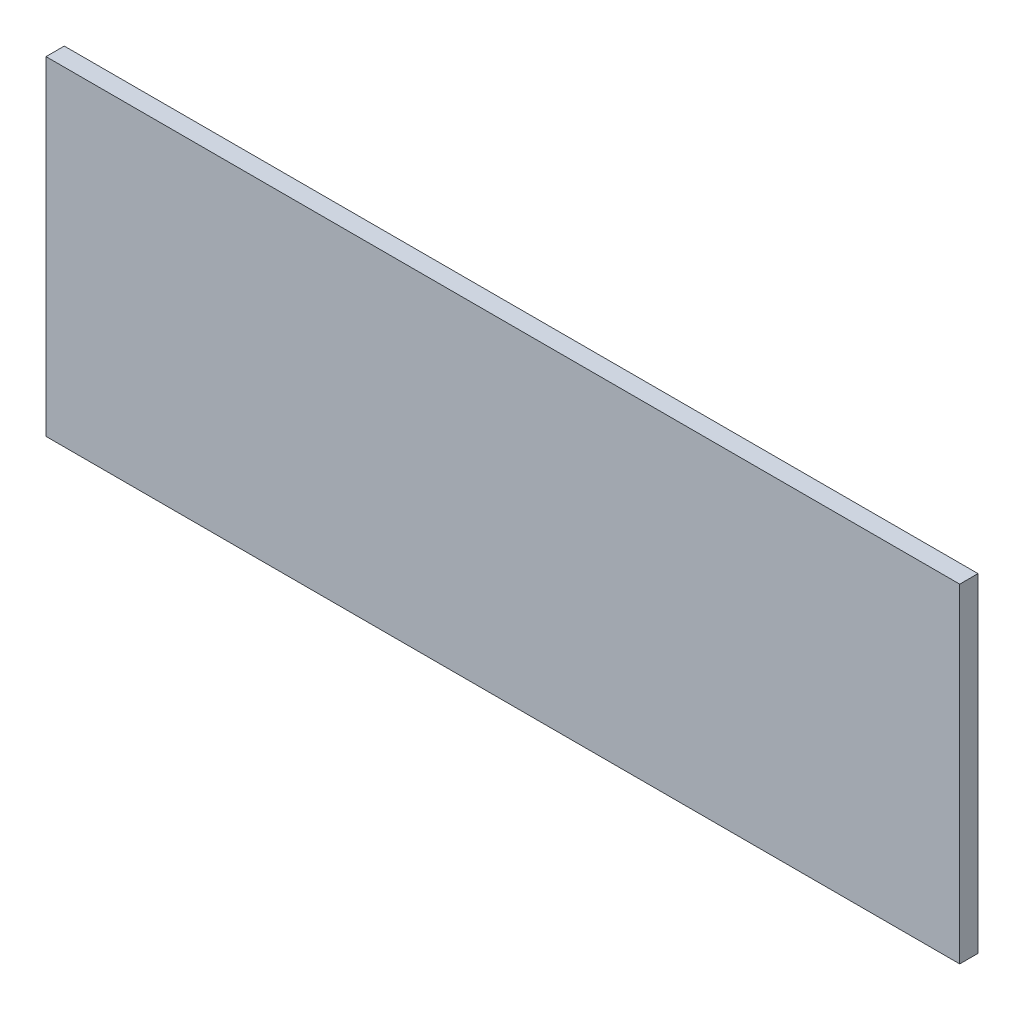
ISO-10303-21;
HEADER;
FILE_DESCRIPTION(('STEP AP214'),'2;1');
FILE_NAME('part.step','',(''),(''),'','','');
FILE_SCHEMA(('AUTOMOTIVE_DESIGN { 1 0 10303 214 1 1 1 1 }'));
ENDSEC;
DATA;
#1=APPLICATION_CONTEXT('core data for automotive mechanical design processes');
#2=APPLICATION_PROTOCOL_DEFINITION('international standard','automotive_design',2000,#1);
#3=PRODUCT_CONTEXT('',#1,'mechanical');
#4=PRODUCT('Part','Part','',(#3));
#5=PRODUCT_RELATED_PRODUCT_CATEGORY('part','',(#4));
#6=PRODUCT_DEFINITION_FORMATION('','',#4);
#7=PRODUCT_DEFINITION_CONTEXT('part definition',#1,'design');
#8=PRODUCT_DEFINITION('design','',#6,#7);
#9=PRODUCT_DEFINITION_SHAPE('','',#8);
#10=(LENGTH_UNIT() NAMED_UNIT(*) SI_UNIT(.MILLI.,.METRE.));
#11=(NAMED_UNIT(*) PLANE_ANGLE_UNIT() SI_UNIT($,.RADIAN.));
#12=(NAMED_UNIT(*) SI_UNIT($,.STERADIAN.) SOLID_ANGLE_UNIT());
#13=UNCERTAINTY_MEASURE_WITH_UNIT(LENGTH_MEASURE(1.E-05),#10,'distance_accuracy_value','');
#14=(GEOMETRIC_REPRESENTATION_CONTEXT(3) GLOBAL_UNCERTAINTY_ASSIGNED_CONTEXT((#13)) GLOBAL_UNIT_ASSIGNED_CONTEXT((#10,
#11,#12)) REPRESENTATION_CONTEXT('',''));
#15=CARTESIAN_POINT('',(0.,0.,0.));
#16=DIRECTION('',(0.,0.,1.));
#17=DIRECTION('',(1.,0.,0.));
#18=AXIS2_PLACEMENT_3D('',#15,#16,#17);
#19=CARTESIAN_POINT('',(0.,-2.25,0.12));
#20=DIRECTION('',(0.,0.,1.));
#21=DIRECTION('',(0.,-1.,0.));
#22=AXIS2_PLACEMENT_3D('',#19,#20,#21);
#23=PLANE('',#22);
#24=DIRECTION('',(-1.,0.,0.));
#25=VECTOR('',#24,1.);
#26=CARTESIAN_POINT('',(0.,0.,0.12));
#27=LINE('',#26,#25);
#28=CARTESIAN_POINT('',(6.25,0.,0.12));
#29=VERTEX_POINT('',#28);
#30=CARTESIAN_POINT('',(-6.25,0.,0.12));
#31=VERTEX_POINT('',#30);
#32=EDGE_CURVE('E11',#29,#31,#27,.T.);
#33=ORIENTED_EDGE('',*,*,#32,.F.);
#34=DIRECTION('',(0.,1.,0.));
#35=VECTOR('',#34,1.);
#36=CARTESIAN_POINT('',(6.25,-2.25,0.12));
#37=LINE('',#36,#35);
#38=CARTESIAN_POINT('',(6.25,-4.5,0.12));
#39=VERTEX_POINT('',#38);
#40=EDGE_CURVE('E70',#39,#29,#37,.T.);
#41=ORIENTED_EDGE('',*,*,#40,.F.);
#42=DIRECTION('',(1.,0.,0.));
#43=VECTOR('',#42,1.);
#44=CARTESIAN_POINT('',(0.,-4.5,0.12));
#45=LINE('',#44,#43);
#46=CARTESIAN_POINT('',(-6.25,-4.5,0.12));
#47=VERTEX_POINT('',#46);
#48=EDGE_CURVE('E19',#47,#39,#45,.T.);
#49=ORIENTED_EDGE('',*,*,#48,.F.);
#50=DIRECTION('',(0.,-1.,0.));
#51=VECTOR('',#50,1.);
#52=CARTESIAN_POINT('',(-6.25,-2.25,0.12));
#53=LINE('',#52,#51);
#54=EDGE_CURVE('E71',#31,#47,#53,.T.);
#55=ORIENTED_EDGE('',*,*,#54,.F.);
#56=EDGE_LOOP('',(#33,#41,#49,#55));
#57=FACE_BOUND('',#56,.T.);
#58=ADVANCED_FACE('F16',(#57),#23,.F.);
#59=CARTESIAN_POINT('',(0.,0.,0.12));
#60=DIRECTION('',(0.,1.,0.));
#61=DIRECTION('',(1.,0.,0.));
#62=AXIS2_PLACEMENT_3D('',#59,#60,#61);
#63=PLANE('',#62);
#64=ORIENTED_EDGE('',*,*,#32,.T.);
#65=DIRECTION('',(0.,0.,-1.));
#66=VECTOR('',#65,1.);
#67=CARTESIAN_POINT('',(-6.25,0.,0.12));
#68=LINE('',#67,#66);
#69=CARTESIAN_POINT('',(-6.25,0.,0.37));
#70=VERTEX_POINT('',#69);
#71=EDGE_CURVE('E26',#70,#31,#68,.T.);
#72=ORIENTED_EDGE('',*,*,#71,.F.);
#73=DIRECTION('',(-1.,0.,0.));
#74=VECTOR('',#73,1.);
#75=CARTESIAN_POINT('',(0.,0.,0.37));
#76=LINE('',#75,#74);
#77=CARTESIAN_POINT('',(6.25,0.,0.37));
#78=VERTEX_POINT('',#77);
#79=EDGE_CURVE('E76',#78,#70,#76,.T.);
#80=ORIENTED_EDGE('',*,*,#79,.F.);
#81=DIRECTION('',(0.,0.,1.));
#82=VECTOR('',#81,1.);
#83=CARTESIAN_POINT('',(6.25,0.,0.12));
#84=LINE('',#83,#82);
#85=EDGE_CURVE('E73',#29,#78,#84,.T.);
#86=ORIENTED_EDGE('',*,*,#85,.F.);
#87=EDGE_LOOP('',(#64,#72,#80,#86));
#88=FACE_BOUND('',#87,.T.);
#89=ADVANCED_FACE('F74',(#88),#63,.T.);
#90=CARTESIAN_POINT('',(-6.25,-2.25,0.12));
#91=DIRECTION('',(-1.,0.,0.));
#92=DIRECTION('',(0.,0.,1.));
#93=AXIS2_PLACEMENT_3D('',#90,#91,#92);
#94=PLANE('',#93);
#95=ORIENTED_EDGE('',*,*,#54,.T.);
#96=DIRECTION('',(0.,0.,-1.));
#97=VECTOR('',#96,1.);
#98=CARTESIAN_POINT('',(-6.25,-4.5,0.12));
#99=LINE('',#98,#97);
#100=CARTESIAN_POINT('',(-6.25,-4.5,0.37));
#101=VERTEX_POINT('',#100);
#102=EDGE_CURVE('E96',#101,#47,#99,.T.);
#103=ORIENTED_EDGE('',*,*,#102,.F.);
#104=DIRECTION('',(0.,-1.,0.));
#105=VECTOR('',#104,1.);
#106=CARTESIAN_POINT('',(-6.25,-2.25,0.37));
#107=LINE('',#106,#105);
#108=EDGE_CURVE('E85',#70,#101,#107,.T.);
#109=ORIENTED_EDGE('',*,*,#108,.F.);
#110=ORIENTED_EDGE('',*,*,#71,.T.);
#111=EDGE_LOOP('',(#95,#103,#109,#110));
#112=FACE_BOUND('',#111,.T.);
#113=ADVANCED_FACE('F115',(#112),#94,.T.);
#114=CARTESIAN_POINT('',(0.,-4.5,0.12));
#115=DIRECTION('',(0.,-1.,0.));
#116=DIRECTION('',(0.,0.,-1.));
#117=AXIS2_PLACEMENT_3D('',#114,#115,#116);
#118=PLANE('',#117);
#119=ORIENTED_EDGE('',*,*,#48,.T.);
#120=DIRECTION('',(0.,0.,-1.));
#121=VECTOR('',#120,1.);
#122=CARTESIAN_POINT('',(6.25,-4.5,0.12));
#123=LINE('',#122,#121);
#124=CARTESIAN_POINT('',(6.25,-4.5,0.37));
#125=VERTEX_POINT('',#124);
#126=EDGE_CURVE('E81',#125,#39,#123,.T.);
#127=ORIENTED_EDGE('',*,*,#126,.F.);
#128=DIRECTION('',(1.,0.,0.));
#129=VECTOR('',#128,1.);
#130=CARTESIAN_POINT('',(0.,-4.5,0.37));
#131=LINE('',#130,#129);
#132=EDGE_CURVE('E102',#101,#125,#131,.T.);
#133=ORIENTED_EDGE('',*,*,#132,.F.);
#134=ORIENTED_EDGE('',*,*,#102,.T.);
#135=EDGE_LOOP('',(#119,#127,#133,#134));
#136=FACE_BOUND('',#135,.T.);
#137=ADVANCED_FACE('F121',(#136),#118,.T.);
#138=CARTESIAN_POINT('',(6.25,-2.25,0.12));
#139=DIRECTION('',(1.,0.,0.));
#140=DIRECTION('',(0.,1.,0.));
#141=AXIS2_PLACEMENT_3D('',#138,#139,#140);
#142=PLANE('',#141);
#143=ORIENTED_EDGE('',*,*,#40,.T.);
#144=ORIENTED_EDGE('',*,*,#85,.T.);
#145=DIRECTION('',(0.,1.,0.));
#146=VECTOR('',#145,1.);
#147=CARTESIAN_POINT('',(6.25,-2.25,0.37));
#148=LINE('',#147,#146);
#149=EDGE_CURVE('E99',#125,#78,#148,.T.);
#150=ORIENTED_EDGE('',*,*,#149,.F.);
#151=ORIENTED_EDGE('',*,*,#126,.T.);
#152=EDGE_LOOP('',(#143,#144,#150,#151));
#153=FACE_BOUND('',#152,.T.);
#154=ADVANCED_FACE('F83',(#153),#142,.T.);
#155=CARTESIAN_POINT('',(0.,-2.25,0.37));
#156=DIRECTION('',(0.,0.,1.));
#157=DIRECTION('',(0.,-1.,0.));
#158=AXIS2_PLACEMENT_3D('',#155,#156,#157);
#159=PLANE('',#158);
#160=ORIENTED_EDGE('',*,*,#132,.T.);
#161=ORIENTED_EDGE('',*,*,#149,.T.);
#162=ORIENTED_EDGE('',*,*,#79,.T.);
#163=ORIENTED_EDGE('',*,*,#108,.T.);
#164=EDGE_LOOP('',(#160,#161,#162,#163));
#165=FACE_BOUND('',#164,.T.);
#166=ADVANCED_FACE('F118',(#165),#159,.T.);
#167=CLOSED_SHELL('',(#58,#89,#113,#137,#154,#166));
#168=MANIFOLD_SOLID_BREP('B1',#167);
#169=ADVANCED_BREP_SHAPE_REPRESENTATION('',(#18,#168),#14);
#170=SHAPE_DEFINITION_REPRESENTATION(#9,#169);
ENDSEC;
END-ISO-10303-21;
